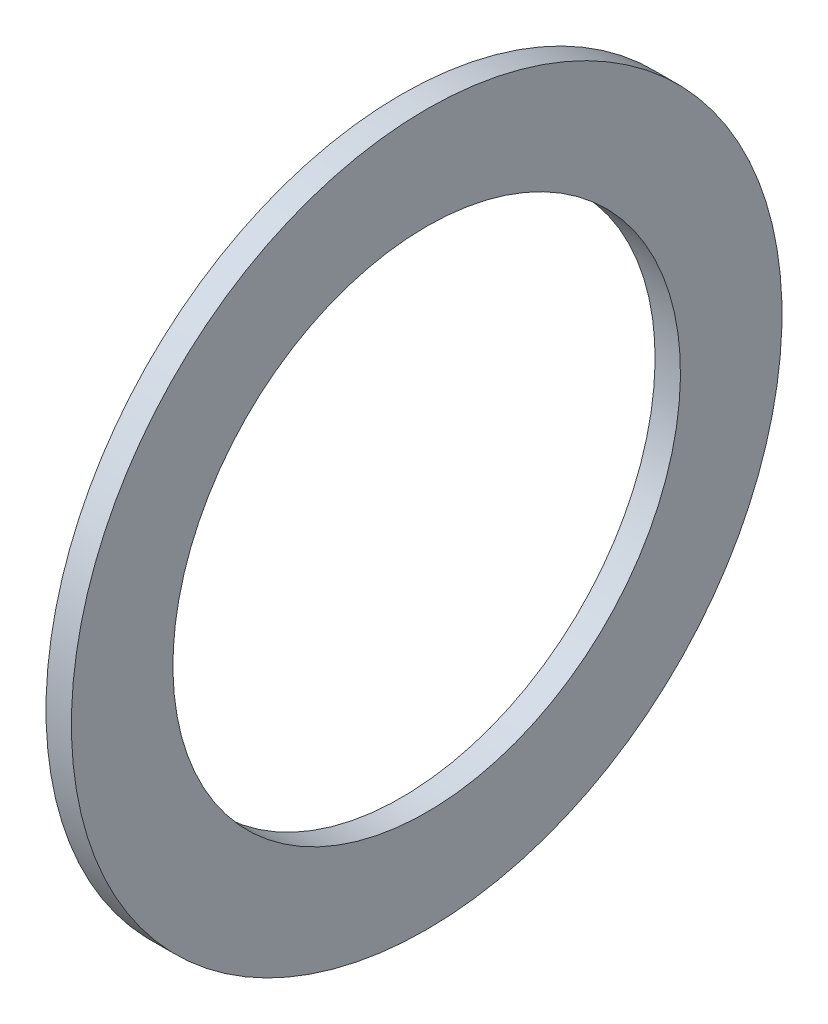
ISO-10303-21;
HEADER;
FILE_DESCRIPTION(('STEP AP214'),'2;1');
FILE_NAME('part.step','',(''),(''),'','','');
FILE_SCHEMA(('AUTOMOTIVE_DESIGN { 1 0 10303 214 1 1 1 1 }'));
ENDSEC;
DATA;
#1=APPLICATION_CONTEXT('core data for automotive mechanical design processes');
#2=APPLICATION_PROTOCOL_DEFINITION('international standard','automotive_design',2000,#1);
#3=PRODUCT_CONTEXT('',#1,'mechanical');
#4=PRODUCT('Part','Part','',(#3));
#5=PRODUCT_RELATED_PRODUCT_CATEGORY('part','',(#4));
#6=PRODUCT_DEFINITION_FORMATION('','',#4);
#7=PRODUCT_DEFINITION_CONTEXT('part definition',#1,'design');
#8=PRODUCT_DEFINITION('design','',#6,#7);
#9=PRODUCT_DEFINITION_SHAPE('','',#8);
#10=(LENGTH_UNIT() NAMED_UNIT(*) SI_UNIT(.MILLI.,.METRE.));
#11=(NAMED_UNIT(*) PLANE_ANGLE_UNIT() SI_UNIT($,.RADIAN.));
#12=(NAMED_UNIT(*) SI_UNIT($,.STERADIAN.) SOLID_ANGLE_UNIT());
#13=UNCERTAINTY_MEASURE_WITH_UNIT(LENGTH_MEASURE(1.E-05),#10,'distance_accuracy_value','');
#14=(GEOMETRIC_REPRESENTATION_CONTEXT(3) GLOBAL_UNCERTAINTY_ASSIGNED_CONTEXT((#13)) GLOBAL_UNIT_ASSIGNED_CONTEXT((#10,
#11,#12)) REPRESENTATION_CONTEXT('',''));
#15=CARTESIAN_POINT('',(0.,0.,0.));
#16=DIRECTION('',(0.,0.,1.));
#17=DIRECTION('',(1.,0.,0.));
#18=AXIS2_PLACEMENT_3D('',#15,#16,#17);
#19=CARTESIAN_POINT('',(0.,0.,0.));
#20=DIRECTION('',(-1.,0.,0.));
#21=DIRECTION('',(0.,0.,1.));
#22=AXIS2_PLACEMENT_3D('',#19,#20,#21);
#23=CYLINDRICAL_SURFACE('',#22,500.);
#24=CARTESIAN_POINT('',(1450.,0.,0.));
#25=DIRECTION('',(-1.,0.,0.));
#26=DIRECTION('',(0.,0.,1.));
#27=AXIS2_PLACEMENT_3D('',#24,#25,#26);
#28=CIRCLE('',#27,500.);
#29=CARTESIAN_POINT('',(1450.,500.,-3.58979302984161E-06));
#30=VERTEX_POINT('',#29);
#31=CARTESIAN_POINT('',(1450.,500.,0.));
#32=VERTEX_POINT('',#31);
#33=EDGE_CURVE('E11',#30,#32,#28,.T.);
#34=ORIENTED_EDGE('',*,*,#33,.T.);
#35=DIRECTION('',(1.,0.,0.));
#36=VECTOR('',#35,1.);
#37=CARTESIAN_POINT('',(1500.,500.,0.));
#38=LINE('',#37,#36);
#39=CARTESIAN_POINT('',(1500.,500.,0.));
#40=VERTEX_POINT('',#39);
#41=EDGE_CURVE('E100',#32,#40,#38,.T.);
#42=ORIENTED_EDGE('',*,*,#41,.T.);
#43=CARTESIAN_POINT('',(1500.,0.,0.));
#44=DIRECTION('',(-1.,0.,0.));
#45=DIRECTION('',(0.,0.,1.));
#46=AXIS2_PLACEMENT_3D('',#43,#44,#45);
#47=CIRCLE('',#46,500.);
#48=CARTESIAN_POINT('',(1500.,500.,-3.58979302984161E-06));
#49=VERTEX_POINT('',#48);
#50=EDGE_CURVE('E80',#49,#40,#47,.T.);
#51=ORIENTED_EDGE('',*,*,#50,.F.);
#52=DIRECTION('',(1.,0.,0.));
#53=VECTOR('',#52,1.);
#54=CARTESIAN_POINT('',(1500.,500.,-3.58979302984161E-06));
#55=LINE('',#54,#53);
#56=EDGE_CURVE('E103',#30,#49,#55,.T.);
#57=ORIENTED_EDGE('',*,*,#56,.F.);
#58=EDGE_LOOP('',(#34,#42,#51,#57));
#59=FACE_BOUND('',#58,.T.);
#60=ADVANCED_FACE('F39',(#59),#23,.F.);
#61=CARTESIAN_POINT('',(1450.,500.,-3.58979302984161E-06));
#62=DIRECTION('',(1.,0.,0.));
#63=DIRECTION('',(0.,0.,-1.));
#64=AXIS2_PLACEMENT_3D('',#61,#62,#63);
#65=PLANE('',#64);
#66=CARTESIAN_POINT('',(1450.,0.,0.));
#67=DIRECTION('',(-1.,0.,0.));
#68=DIRECTION('',(0.,0.,1.));
#69=AXIS2_PLACEMENT_3D('',#66,#67,#68);
#70=CIRCLE('',#69,700.);
#71=CARTESIAN_POINT('',(1450.,700.,-5.02571024177826E-06));
#72=VERTEX_POINT('',#71);
#73=CARTESIAN_POINT('',(1450.,700.,0.));
#74=VERTEX_POINT('',#73);
#75=EDGE_CURVE('E50',#72,#74,#70,.T.);
#76=ORIENTED_EDGE('',*,*,#75,.T.);
#77=DIRECTION('',(0.,-1.,0.));
#78=VECTOR('',#77,1.);
#79=CARTESIAN_POINT('',(1450.,500.,0.));
#80=LINE('',#79,#78);
#81=EDGE_CURVE('E104',#74,#32,#80,.T.);
#82=ORIENTED_EDGE('',*,*,#81,.T.);
#83=ORIENTED_EDGE('',*,*,#33,.F.);
#84=DIRECTION('',(0.,-1.,7.17958605968322E-09));
#85=VECTOR('',#84,1.);
#86=CARTESIAN_POINT('',(1450.,500.,-3.58979302984161E-06));
#87=LINE('',#86,#85);
#88=EDGE_CURVE('E91',#72,#30,#87,.T.);
#89=ORIENTED_EDGE('',*,*,#88,.F.);
#90=EDGE_LOOP('',(#76,#82,#83,#89));
#91=FACE_BOUND('',#90,.T.);
#92=ADVANCED_FACE('F41',(#91),#65,.F.);
#93=CARTESIAN_POINT('',(0.,0.,0.));
#94=DIRECTION('',(-1.,0.,0.));
#95=DIRECTION('',(0.,0.,1.));
#96=AXIS2_PLACEMENT_3D('',#93,#94,#95);
#97=CYLINDRICAL_SURFACE('',#96,700.);
#98=CARTESIAN_POINT('',(1500.,0.,0.));
#99=DIRECTION('',(-1.,0.,0.));
#100=DIRECTION('',(0.,0.,1.));
#101=AXIS2_PLACEMENT_3D('',#98,#99,#100);
#102=CIRCLE('',#101,700.);
#103=CARTESIAN_POINT('',(1500.,700.,-5.02571024177826E-06));
#104=VERTEX_POINT('',#103);
#105=CARTESIAN_POINT('',(1500.,700.,0.));
#106=VERTEX_POINT('',#105);
#107=EDGE_CURVE('E89',#104,#106,#102,.T.);
#108=ORIENTED_EDGE('',*,*,#107,.T.);
#109=DIRECTION('',(-1.,0.,0.));
#110=VECTOR('',#109,1.);
#111=CARTESIAN_POINT('',(1450.,700.,0.));
#112=LINE('',#111,#110);
#113=EDGE_CURVE('E97',#106,#74,#112,.T.);
#114=ORIENTED_EDGE('',*,*,#113,.T.);
#115=ORIENTED_EDGE('',*,*,#75,.F.);
#116=DIRECTION('',(-1.,0.,0.));
#117=VECTOR('',#116,1.);
#118=CARTESIAN_POINT('',(1450.,700.,-5.02571024177826E-06));
#119=LINE('',#118,#117);
#120=EDGE_CURVE('E109',#104,#72,#119,.T.);
#121=ORIENTED_EDGE('',*,*,#120,.F.);
#122=EDGE_LOOP('',(#108,#114,#115,#121));
#123=FACE_BOUND('',#122,.T.);
#124=ADVANCED_FACE('F112',(#123),#97,.T.);
#125=CARTESIAN_POINT('',(1500.,700.,-5.02571024177826E-06));
#126=DIRECTION('',(-1.,0.,0.));
#127=DIRECTION('',(0.,0.,1.));
#128=AXIS2_PLACEMENT_3D('',#125,#126,#127);
#129=PLANE('',#128);
#130=DIRECTION('',(0.,1.,-7.17958605968322E-09));
#131=VECTOR('',#130,1.);
#132=CARTESIAN_POINT('',(1500.,700.,-5.02571024177826E-06));
#133=LINE('',#132,#131);
#134=EDGE_CURVE('E82',#49,#104,#133,.T.);
#135=ORIENTED_EDGE('',*,*,#134,.F.);
#136=ORIENTED_EDGE('',*,*,#50,.T.);
#137=DIRECTION('',(0.,1.,0.));
#138=VECTOR('',#137,1.);
#139=CARTESIAN_POINT('',(1500.,700.,0.));
#140=LINE('',#139,#138);
#141=EDGE_CURVE('E85',#40,#106,#140,.T.);
#142=ORIENTED_EDGE('',*,*,#141,.T.);
#143=ORIENTED_EDGE('',*,*,#107,.F.);
#144=EDGE_LOOP('',(#135,#136,#142,#143));
#145=FACE_BOUND('',#144,.T.);
#146=ADVANCED_FACE('F83',(#145),#129,.F.);
#147=CARTESIAN_POINT('',(0.,0.,0.));
#148=DIRECTION('',(0.,-7.17958605968322E-09,-1.));
#149=DIRECTION('',(-1.,0.,0.));
#150=AXIS2_PLACEMENT_3D('',#147,#148,#149);
#151=PLANE('',#150);
#152=ORIENTED_EDGE('',*,*,#56,.T.);
#153=ORIENTED_EDGE('',*,*,#134,.T.);
#154=ORIENTED_EDGE('',*,*,#120,.T.);
#155=ORIENTED_EDGE('',*,*,#88,.T.);
#156=EDGE_LOOP('',(#152,#153,#154,#155));
#157=FACE_BOUND('',#156,.T.);
#158=ADVANCED_FACE('F111',(#157),#151,.F.);
#159=CARTESIAN_POINT('',(0.,0.,0.));
#160=DIRECTION('',(0.,0.,-1.));
#161=DIRECTION('',(-1.,0.,0.));
#162=AXIS2_PLACEMENT_3D('',#159,#160,#161);
#163=PLANE('',#162);
#164=ORIENTED_EDGE('',*,*,#41,.F.);
#165=ORIENTED_EDGE('',*,*,#81,.F.);
#166=ORIENTED_EDGE('',*,*,#113,.F.);
#167=ORIENTED_EDGE('',*,*,#141,.F.);
#168=EDGE_LOOP('',(#164,#165,#166,#167));
#169=FACE_BOUND('',#168,.T.);
#170=ADVANCED_FACE('F94',(#169),#163,.T.);
#171=CLOSED_SHELL('',(#60,#92,#124,#146,#158,#170));
#172=MANIFOLD_SOLID_BREP('B2',#171);
#173=ADVANCED_BREP_SHAPE_REPRESENTATION('',(#18,#172),#14);
#174=SHAPE_DEFINITION_REPRESENTATION(#9,#173);
ENDSEC;
END-ISO-10303-21;
